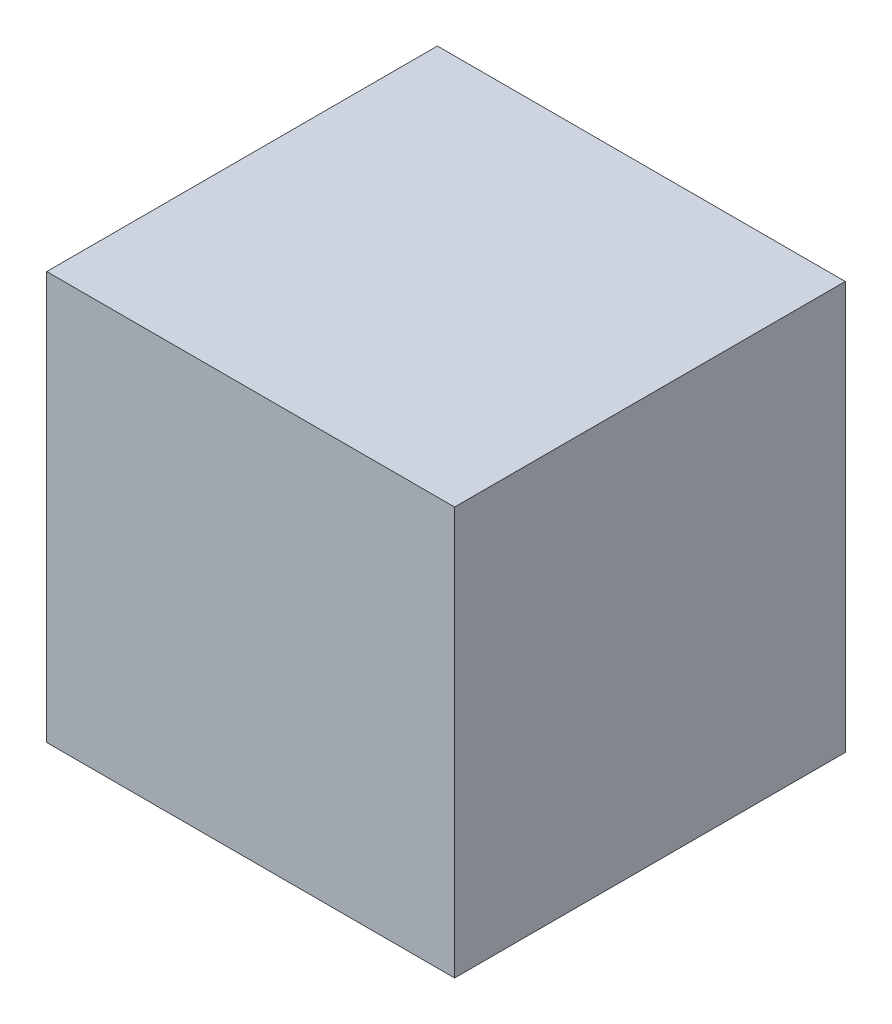
ISO-10303-21;
HEADER;
FILE_DESCRIPTION(('STEP AP214'),'2;1');
FILE_NAME('part.step','',(''),(''),'','','');
FILE_SCHEMA(('AUTOMOTIVE_DESIGN { 1 0 10303 214 1 1 1 1 }'));
ENDSEC;
DATA;
#1=APPLICATION_CONTEXT('core data for automotive mechanical design processes');
#2=APPLICATION_PROTOCOL_DEFINITION('international standard','automotive_design',2000,#1);
#3=PRODUCT_CONTEXT('',#1,'mechanical');
#4=PRODUCT('Part','Part','',(#3));
#5=PRODUCT_RELATED_PRODUCT_CATEGORY('part','',(#4));
#6=PRODUCT_DEFINITION_FORMATION('','',#4);
#7=PRODUCT_DEFINITION_CONTEXT('part definition',#1,'design');
#8=PRODUCT_DEFINITION('design','',#6,#7);
#9=PRODUCT_DEFINITION_SHAPE('','',#8);
#10=(LENGTH_UNIT() NAMED_UNIT(*) SI_UNIT(.MILLI.,.METRE.));
#11=(NAMED_UNIT(*) PLANE_ANGLE_UNIT() SI_UNIT($,.RADIAN.));
#12=(NAMED_UNIT(*) SI_UNIT($,.STERADIAN.) SOLID_ANGLE_UNIT());
#13=UNCERTAINTY_MEASURE_WITH_UNIT(LENGTH_MEASURE(1.E-05),#10,'distance_accuracy_value','');
#14=(GEOMETRIC_REPRESENTATION_CONTEXT(3) GLOBAL_UNCERTAINTY_ASSIGNED_CONTEXT((#13)) GLOBAL_UNIT_ASSIGNED_CONTEXT((#10,
#11,#12)) REPRESENTATION_CONTEXT('',''));
#15=CARTESIAN_POINT('',(0.,0.,0.));
#16=DIRECTION('',(0.,0.,1.));
#17=DIRECTION('',(1.,0.,0.));
#18=AXIS2_PLACEMENT_3D('',#15,#16,#17);
#19=CARTESIAN_POINT('',(0.,38.,0.));
#20=DIRECTION('',(1.,0.,0.));
#21=DIRECTION('',(0.,0.,-1.));
#22=AXIS2_PLACEMENT_3D('',#19,#20,#21);
#23=PLANE('',#22);
#24=DIRECTION('',(0.,0.,1.));
#25=VECTOR('',#24,1.);
#26=CARTESIAN_POINT('',(0.,0.,0.));
#27=LINE('',#26,#25);
#28=CARTESIAN_POINT('',(0.,0.,-36.4));
#29=VERTEX_POINT('',#28);
#30=CARTESIAN_POINT('',(0.,0.,0.));
#31=VERTEX_POINT('',#30);
#32=EDGE_CURVE('E98',#29,#31,#27,.T.);
#33=ORIENTED_EDGE('',*,*,#32,.T.);
#34=DIRECTION('',(0.,-1.,0.));
#35=VECTOR('',#34,1.);
#36=CARTESIAN_POINT('',(0.,38.,0.));
#37=LINE('',#36,#35);
#38=CARTESIAN_POINT('',(0.,38.,0.));
#39=VERTEX_POINT('',#38);
#40=EDGE_CURVE('E11',#39,#31,#37,.T.);
#41=ORIENTED_EDGE('',*,*,#40,.F.);
#42=DIRECTION('',(0.,0.,1.));
#43=VECTOR('',#42,1.);
#44=CARTESIAN_POINT('',(0.,38.,0.));
#45=LINE('',#44,#43);
#46=CARTESIAN_POINT('',(0.,38.,-36.4));
#47=VERTEX_POINT('',#46);
#48=EDGE_CURVE('E86',#47,#39,#45,.T.);
#49=ORIENTED_EDGE('',*,*,#48,.F.);
#50=DIRECTION('',(0.,-1.,0.));
#51=VECTOR('',#50,1.);
#52=CARTESIAN_POINT('',(0.,38.,-36.4));
#53=LINE('',#52,#51);
#54=EDGE_CURVE('E94',#47,#29,#53,.T.);
#55=ORIENTED_EDGE('',*,*,#54,.T.);
#56=EDGE_LOOP('',(#33,#41,#49,#55));
#57=FACE_BOUND('',#56,.T.);
#58=ADVANCED_FACE('F35',(#57),#23,.F.);
#59=CARTESIAN_POINT('',(0.,38.,0.));
#60=DIRECTION('',(0.,0.,-1.));
#61=DIRECTION('',(-1.,0.,0.));
#62=AXIS2_PLACEMENT_3D('',#59,#60,#61);
#63=PLANE('',#62);
#64=DIRECTION('',(1.,0.,0.));
#65=VECTOR('',#64,1.);
#66=CARTESIAN_POINT('',(0.,0.,0.));
#67=LINE('',#66,#65);
#68=CARTESIAN_POINT('',(38.,0.,0.));
#69=VERTEX_POINT('',#68);
#70=EDGE_CURVE('E90',#31,#69,#67,.T.);
#71=ORIENTED_EDGE('',*,*,#70,.T.);
#72=DIRECTION('',(0.,-1.,0.));
#73=VECTOR('',#72,1.);
#74=CARTESIAN_POINT('',(38.,38.,0.));
#75=LINE('',#74,#73);
#76=CARTESIAN_POINT('',(38.,38.,0.));
#77=VERTEX_POINT('',#76);
#78=EDGE_CURVE('E43',#77,#69,#75,.T.);
#79=ORIENTED_EDGE('',*,*,#78,.F.);
#80=DIRECTION('',(1.,0.,0.));
#81=VECTOR('',#80,1.);
#82=CARTESIAN_POINT('',(0.,38.,0.));
#83=LINE('',#82,#81);
#84=EDGE_CURVE('E81',#39,#77,#83,.T.);
#85=ORIENTED_EDGE('',*,*,#84,.F.);
#86=ORIENTED_EDGE('',*,*,#40,.T.);
#87=EDGE_LOOP('',(#71,#79,#85,#86));
#88=FACE_BOUND('',#87,.T.);
#89=ADVANCED_FACE('F89',(#88),#63,.F.);
#90=CARTESIAN_POINT('',(38.,38.,0.));
#91=DIRECTION('',(-1.,0.,0.));
#92=DIRECTION('',(0.,0.,1.));
#93=AXIS2_PLACEMENT_3D('',#90,#91,#92);
#94=PLANE('',#93);
#95=DIRECTION('',(0.,0.,-1.));
#96=VECTOR('',#95,1.);
#97=CARTESIAN_POINT('',(38.,0.,0.));
#98=LINE('',#97,#96);
#99=CARTESIAN_POINT('',(38.,0.,-36.4));
#100=VERTEX_POINT('',#99);
#101=EDGE_CURVE('E68',#69,#100,#98,.T.);
#102=ORIENTED_EDGE('',*,*,#101,.T.);
#103=DIRECTION('',(0.,-1.,0.));
#104=VECTOR('',#103,1.);
#105=CARTESIAN_POINT('',(38.,38.,-36.4));
#106=LINE('',#105,#104);
#107=CARTESIAN_POINT('',(38.,38.,-36.4));
#108=VERTEX_POINT('',#107);
#109=EDGE_CURVE('E91',#108,#100,#106,.T.);
#110=ORIENTED_EDGE('',*,*,#109,.F.);
#111=DIRECTION('',(0.,0.,-1.));
#112=VECTOR('',#111,1.);
#113=CARTESIAN_POINT('',(38.,38.,0.));
#114=LINE('',#113,#112);
#115=EDGE_CURVE('E84',#77,#108,#114,.T.);
#116=ORIENTED_EDGE('',*,*,#115,.F.);
#117=ORIENTED_EDGE('',*,*,#78,.T.);
#118=EDGE_LOOP('',(#102,#110,#116,#117));
#119=FACE_BOUND('',#118,.T.);
#120=ADVANCED_FACE('F92',(#119),#94,.F.);
#121=CARTESIAN_POINT('',(0.,38.,-36.4));
#122=DIRECTION('',(0.,0.,1.));
#123=DIRECTION('',(1.,0.,0.));
#124=AXIS2_PLACEMENT_3D('',#121,#122,#123);
#125=PLANE('',#124);
#126=DIRECTION('',(-1.,0.,0.));
#127=VECTOR('',#126,1.);
#128=CARTESIAN_POINT('',(0.,0.,-36.4));
#129=LINE('',#128,#127);
#130=EDGE_CURVE('E74',#100,#29,#129,.T.);
#131=ORIENTED_EDGE('',*,*,#130,.T.);
#132=ORIENTED_EDGE('',*,*,#54,.F.);
#133=DIRECTION('',(-1.,0.,0.));
#134=VECTOR('',#133,1.);
#135=CARTESIAN_POINT('',(0.,38.,-36.4));
#136=LINE('',#135,#134);
#137=EDGE_CURVE('E51',#108,#47,#136,.T.);
#138=ORIENTED_EDGE('',*,*,#137,.F.);
#139=ORIENTED_EDGE('',*,*,#109,.T.);
#140=EDGE_LOOP('',(#131,#132,#138,#139));
#141=FACE_BOUND('',#140,.T.);
#142=ADVANCED_FACE('F105',(#141),#125,.F.);
#143=CARTESIAN_POINT('',(0.,38.,0.));
#144=DIRECTION('',(0.,-1.,0.));
#145=DIRECTION('',(0.,0.,-1.));
#146=AXIS2_PLACEMENT_3D('',#143,#144,#145);
#147=PLANE('',#146);
#148=ORIENTED_EDGE('',*,*,#48,.T.);
#149=ORIENTED_EDGE('',*,*,#84,.T.);
#150=ORIENTED_EDGE('',*,*,#115,.T.);
#151=ORIENTED_EDGE('',*,*,#137,.T.);
#152=EDGE_LOOP('',(#148,#149,#150,#151));
#153=FACE_BOUND('',#152,.T.);
#154=ADVANCED_FACE('F82',(#153),#147,.F.);
#155=CARTESIAN_POINT('',(0.,0.,0.));
#156=DIRECTION('',(0.,-1.,0.));
#157=DIRECTION('',(0.,0.,-1.));
#158=AXIS2_PLACEMENT_3D('',#155,#156,#157);
#159=PLANE('',#158);
#160=ORIENTED_EDGE('',*,*,#32,.F.);
#161=ORIENTED_EDGE('',*,*,#130,.F.);
#162=ORIENTED_EDGE('',*,*,#101,.F.);
#163=ORIENTED_EDGE('',*,*,#70,.F.);
#164=EDGE_LOOP('',(#160,#161,#162,#163));
#165=FACE_BOUND('',#164,.T.);
#166=ADVANCED_FACE('F108',(#165),#159,.T.);
#167=CLOSED_SHELL('',(#58,#89,#120,#142,#154,#166));
#168=MANIFOLD_SOLID_BREP('B2',#167);
#169=ADVANCED_BREP_SHAPE_REPRESENTATION('',(#18,#168),#14);
#170=SHAPE_DEFINITION_REPRESENTATION(#9,#169);
ENDSEC;
END-ISO-10303-21;
